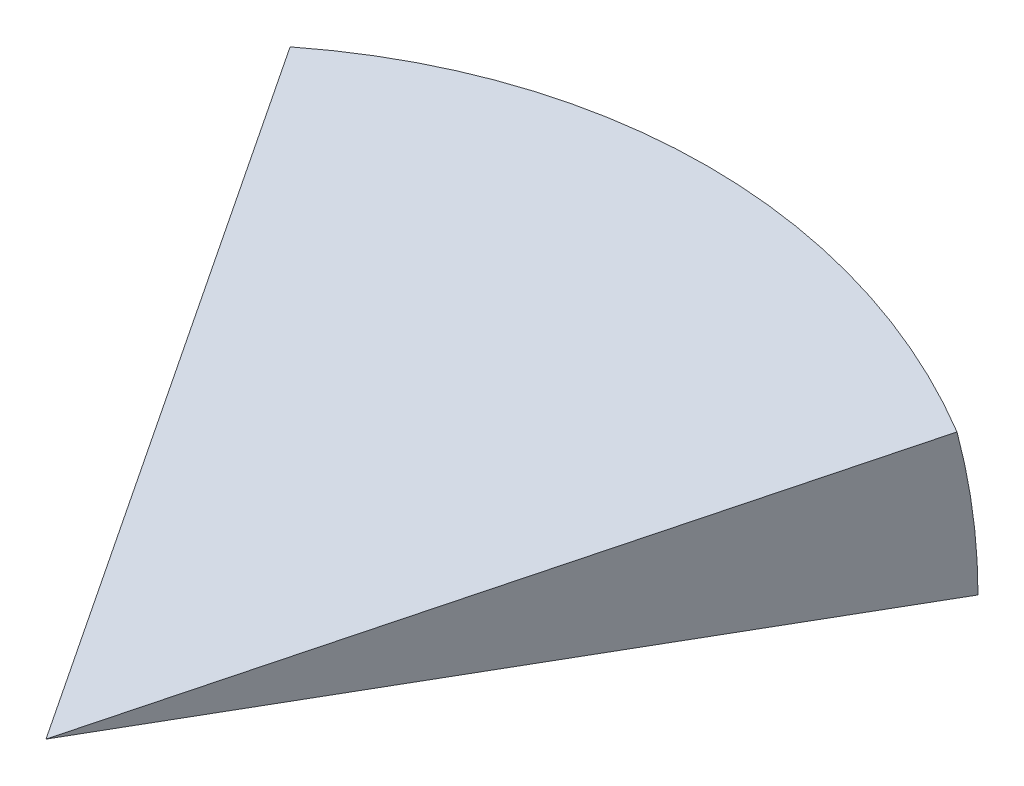
ISO-10303-21;
HEADER;
FILE_DESCRIPTION(('STEP AP214'),'2;1');
FILE_NAME('part.step','',(''),(''),'','','');
FILE_SCHEMA(('AUTOMOTIVE_DESIGN { 1 0 10303 214 1 1 1 1 }'));
ENDSEC;
DATA;
#1=APPLICATION_CONTEXT('core data for automotive mechanical design processes');
#2=APPLICATION_PROTOCOL_DEFINITION('international standard','automotive_design',2000,#1);
#3=PRODUCT_CONTEXT('',#1,'mechanical');
#4=PRODUCT('Part','Part','',(#3));
#5=PRODUCT_RELATED_PRODUCT_CATEGORY('part','',(#4));
#6=PRODUCT_DEFINITION_FORMATION('','',#4);
#7=PRODUCT_DEFINITION_CONTEXT('part definition',#1,'design');
#8=PRODUCT_DEFINITION('design','',#6,#7);
#9=PRODUCT_DEFINITION_SHAPE('','',#8);
#10=(LENGTH_UNIT() NAMED_UNIT(*) SI_UNIT(.MILLI.,.METRE.));
#11=(NAMED_UNIT(*) PLANE_ANGLE_UNIT() SI_UNIT($,.RADIAN.));
#12=(NAMED_UNIT(*) SI_UNIT($,.STERADIAN.) SOLID_ANGLE_UNIT());
#13=UNCERTAINTY_MEASURE_WITH_UNIT(LENGTH_MEASURE(1.E-05),#10,'distance_accuracy_value','');
#14=(GEOMETRIC_REPRESENTATION_CONTEXT(3) GLOBAL_UNCERTAINTY_ASSIGNED_CONTEXT((#13)) GLOBAL_UNIT_ASSIGNED_CONTEXT((#10,
#11,#12)) REPRESENTATION_CONTEXT('',''));
#15=CARTESIAN_POINT('',(0.,0.,0.));
#16=DIRECTION('',(0.,0.,1.));
#17=DIRECTION('',(1.,0.,0.));
#18=AXIS2_PLACEMENT_3D('',#15,#16,#17);
#19=CARTESIAN_POINT('',(0.,0.,0.));
#20=DIRECTION('',(-1.,0.,0.));
#21=DIRECTION('',(0.,0.241921895599668,-0.970295726275996));
#22=AXIS2_PLACEMENT_3D('',#19,#20,#21);
#23=SPHERICAL_SURFACE('',#22,30.);
#24=CARTESIAN_POINT('',(0.,0.,0.));
#25=DIRECTION('',(-0.866025403784442,0.,0.499999999999995));
#26=DIRECTION('',(0.499999999999995,0.,0.866025403784442));
#27=AXIS2_PLACEMENT_3D('',#24,#25,#26);
#28=CIRCLE('',#27,30.);
#29=CARTESIAN_POINT('',(-14.6620957530578,6.33180799713938,-25.3954947897363));
#30=VERTEX_POINT('',#29);
#31=CARTESIAN_POINT('',(-14.9999999999998,0.,-25.9807621135332));
#32=VERTEX_POINT('',#31);
#33=EDGE_CURVE('E50',#30,#32,#28,.T.);
#34=ORIENTED_EDGE('',*,*,#33,.F.);
#35=CARTESIAN_POINT('',(0.,0.,0.));
#36=DIRECTION('',(0.,0.970295726275996,0.241921895599668));
#37=DIRECTION('',(0.,0.241921895599668,-0.970295726275996));
#38=AXIS2_PLACEMENT_3D('',#35,#36,#37);
#39=CIRCLE('',#38,30.);
#40=CARTESIAN_POINT('',(14.6620957530578,6.33180799713938,-25.3954947897363));
#41=VERTEX_POINT('',#40);
#42=EDGE_CURVE('E43',#41,#30,#39,.T.);
#43=ORIENTED_EDGE('',*,*,#42,.F.);
#44=CARTESIAN_POINT('',(0.,0.,0.));
#45=DIRECTION('',(0.866025403784442,0.,0.499999999999995));
#46=DIRECTION('',(0.499999999999995,0.,-0.866025403784442));
#47=AXIS2_PLACEMENT_3D('',#44,#45,#46);
#48=CIRCLE('',#47,30.);
#49=CARTESIAN_POINT('',(14.9999999999999,0.,-25.9807621135333));
#50=VERTEX_POINT('',#49);
#51=EDGE_CURVE('E58',#50,#41,#48,.T.);
#52=ORIENTED_EDGE('',*,*,#51,.F.);
#53=CARTESIAN_POINT('',(0.,0.,0.));
#54=DIRECTION('',(0.,1.,0.));
#55=DIRECTION('',(0.,0.,-1.));
#56=AXIS2_PLACEMENT_3D('',#53,#54,#55);
#57=CIRCLE('',#56,30.);
#58=EDGE_CURVE('E82',#50,#32,#57,.T.);
#59=ORIENTED_EDGE('',*,*,#58,.T.);
#60=EDGE_LOOP('',(#34,#43,#52,#59));
#61=FACE_BOUND('',#60,.T.);
#62=ADVANCED_FACE('F36',(#61),#23,.T.);
#63=CARTESIAN_POINT('',(0.,0.,0.));
#64=DIRECTION('',(0.,-0.970295726275996,-0.241921895599668));
#65=DIRECTION('',(0.,0.241921895599668,-0.970295726275996));
#66=AXIS2_PLACEMENT_3D('',#63,#64,#65);
#67=PLANE('',#66);
#68=DIRECTION('',(-0.488736525101927,0.211060266571313,-0.846516492991211));
#69=VECTOR('',#68,1.);
#70=CARTESIAN_POINT('',(0.,0.,0.));
#71=LINE('',#70,#69);
#72=CARTESIAN_POINT('',(0.,0.,0.));
#73=VERTEX_POINT('',#72);
#74=EDGE_CURVE('E68',#73,#30,#71,.T.);
#75=ORIENTED_EDGE('',*,*,#74,.F.);
#76=DIRECTION('',(-0.488736525101927,-0.211060266571313,0.846516492991211));
#77=VECTOR('',#76,1.);
#78=CARTESIAN_POINT('',(0.,0.,0.));
#79=LINE('',#78,#77);
#80=EDGE_CURVE('E76',#41,#73,#79,.T.);
#81=ORIENTED_EDGE('',*,*,#80,.F.);
#82=ORIENTED_EDGE('',*,*,#42,.T.);
#83=EDGE_LOOP('',(#75,#81,#82));
#84=FACE_BOUND('',#83,.T.);
#85=ADVANCED_FACE('F75',(#84),#67,.F.);
#86=CARTESIAN_POINT('',(0.,0.,0.));
#87=DIRECTION('',(0.,-1.,0.));
#88=DIRECTION('',(0.,0.,-1.));
#89=AXIS2_PLACEMENT_3D('',#86,#87,#88);
#90=PLANE('',#89);
#91=DIRECTION('',(-0.499999999999995,0.,0.866025403784442));
#92=VECTOR('',#91,1.);
#93=CARTESIAN_POINT('',(0.,0.,0.));
#94=LINE('',#93,#92);
#95=EDGE_CURVE('E11',#50,#73,#94,.T.);
#96=ORIENTED_EDGE('',*,*,#95,.T.);
#97=DIRECTION('',(-0.499999999999995,0.,-0.866025403784442));
#98=VECTOR('',#97,1.);
#99=CARTESIAN_POINT('',(0.,0.,0.));
#100=LINE('',#99,#98);
#101=EDGE_CURVE('E65',#73,#32,#100,.T.);
#102=ORIENTED_EDGE('',*,*,#101,.T.);
#103=ORIENTED_EDGE('',*,*,#58,.F.);
#104=EDGE_LOOP('',(#96,#102,#103));
#105=FACE_BOUND('',#104,.T.);
#106=ADVANCED_FACE('F81',(#105),#90,.T.);
#107=CARTESIAN_POINT('',(0.,0.,0.));
#108=DIRECTION('',(0.866025403784442,0.,0.499999999999995));
#109=DIRECTION('',(0.499999999999995,0.,-0.866025403784442));
#110=AXIS2_PLACEMENT_3D('',#107,#108,#109);
#111=PLANE('',#110);
#112=ORIENTED_EDGE('',*,*,#51,.T.);
#113=ORIENTED_EDGE('',*,*,#80,.T.);
#114=ORIENTED_EDGE('',*,*,#95,.F.);
#115=EDGE_LOOP('',(#112,#113,#114));
#116=FACE_BOUND('',#115,.T.);
#117=ADVANCED_FACE('F79',(#116),#111,.T.);
#118=CARTESIAN_POINT('',(0.,0.,0.));
#119=DIRECTION('',(-0.866025403784442,0.,0.499999999999995));
#120=DIRECTION('',(0.499999999999995,0.,0.866025403784442));
#121=AXIS2_PLACEMENT_3D('',#118,#119,#120);
#122=PLANE('',#121);
#123=ORIENTED_EDGE('',*,*,#33,.T.);
#124=ORIENTED_EDGE('',*,*,#101,.F.);
#125=ORIENTED_EDGE('',*,*,#74,.T.);
#126=EDGE_LOOP('',(#123,#124,#125));
#127=FACE_BOUND('',#126,.T.);
#128=ADVANCED_FACE('F67',(#127),#122,.T.);
#129=CLOSED_SHELL('',(#62,#85,#106,#117,#128));
#130=MANIFOLD_SOLID_BREP('B2',#129);
#131=ADVANCED_BREP_SHAPE_REPRESENTATION('',(#18,#130),#14);
#132=SHAPE_DEFINITION_REPRESENTATION(#9,#131);
ENDSEC;
END-ISO-10303-21;
